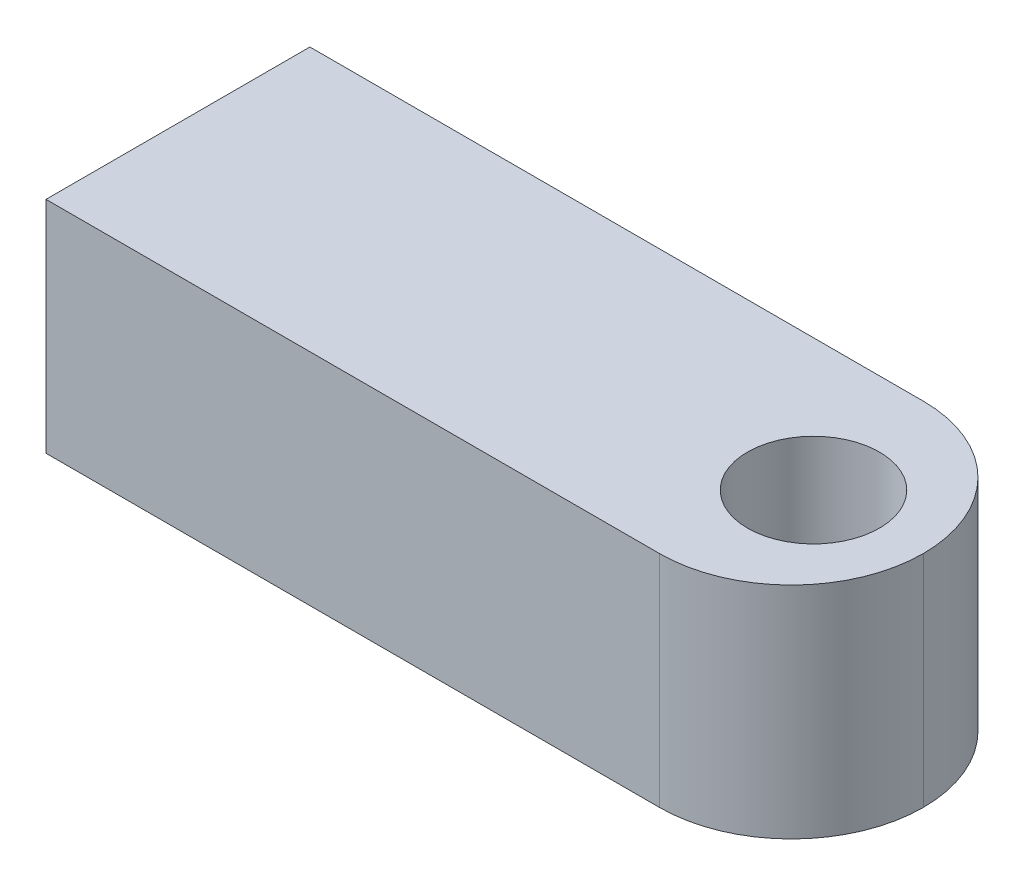
ISO-10303-21;
HEADER;
FILE_DESCRIPTION(('STEP AP214'),'2;1');
FILE_NAME('part.step','',(''),(''),'','','');
FILE_SCHEMA(('AUTOMOTIVE_DESIGN { 1 0 10303 214 1 1 1 1 }'));
ENDSEC;
DATA;
#1=APPLICATION_CONTEXT('core data for automotive mechanical design processes');
#2=APPLICATION_PROTOCOL_DEFINITION('international standard','automotive_design',2000,#1);
#3=PRODUCT_CONTEXT('',#1,'mechanical');
#4=PRODUCT('Part','Part','',(#3));
#5=PRODUCT_RELATED_PRODUCT_CATEGORY('part','',(#4));
#6=PRODUCT_DEFINITION_FORMATION('','',#4);
#7=PRODUCT_DEFINITION_CONTEXT('part definition',#1,'design');
#8=PRODUCT_DEFINITION('design','',#6,#7);
#9=PRODUCT_DEFINITION_SHAPE('','',#8);
#10=(LENGTH_UNIT() NAMED_UNIT(*) SI_UNIT(.MILLI.,.METRE.));
#11=(NAMED_UNIT(*) PLANE_ANGLE_UNIT() SI_UNIT($,.RADIAN.));
#12=(NAMED_UNIT(*) SI_UNIT($,.STERADIAN.) SOLID_ANGLE_UNIT());
#13=UNCERTAINTY_MEASURE_WITH_UNIT(LENGTH_MEASURE(1.E-05),#10,'distance_accuracy_value','');
#14=(GEOMETRIC_REPRESENTATION_CONTEXT(3) GLOBAL_UNCERTAINTY_ASSIGNED_CONTEXT((#13)) GLOBAL_UNIT_ASSIGNED_CONTEXT((#10,
#11,#12)) REPRESENTATION_CONTEXT('',''));
#15=CARTESIAN_POINT('',(0.,0.,0.));
#16=DIRECTION('',(0.,0.,1.));
#17=DIRECTION('',(1.,0.,0.));
#18=AXIS2_PLACEMENT_3D('',#15,#16,#17);
#19=CARTESIAN_POINT('',(0.,10.,0.));
#20=DIRECTION('',(0.,1.,0.));
#21=DIRECTION('',(0.,0.,1.));
#22=AXIS2_PLACEMENT_3D('',#19,#20,#21);
#23=PLANE('',#22);
#24=CARTESIAN_POINT('',(27.8954021384951,10.,0.));
#25=DIRECTION('',(0.,1.,0.));
#26=DIRECTION('',(0.,0.,1.));
#27=AXIS2_PLACEMENT_3D('',#24,#25,#26);
#28=CIRCLE('',#27,6.);
#29=CARTESIAN_POINT('',(27.8954021384951,10.,6.));
#30=VERTEX_POINT('',#29);
#31=CARTESIAN_POINT('',(33.8954021384951,10.,0.));
#32=VERTEX_POINT('',#31);
#33=EDGE_CURVE('E76',#30,#32,#28,.T.);
#34=ORIENTED_EDGE('',*,*,#33,.T.);
#35=CARTESIAN_POINT('',(27.8954021384951,10.,0.));
#36=DIRECTION('',(0.,1.,0.));
#37=DIRECTION('',(0.,0.,1.));
#38=AXIS2_PLACEMENT_3D('',#35,#36,#37);
#39=CIRCLE('',#38,6.);
#40=CARTESIAN_POINT('',(27.8954021384951,10.,-6.));
#41=VERTEX_POINT('',#40);
#42=EDGE_CURVE('E69',#32,#41,#39,.T.);
#43=ORIENTED_EDGE('',*,*,#42,.T.);
#44=DIRECTION('',(1.,0.,0.));
#45=VECTOR('',#44,1.);
#46=CARTESIAN_POINT('',(0.,10.,-6.));
#47=LINE('',#46,#45);
#48=CARTESIAN_POINT('',(0.,10.,-6.));
#49=VERTEX_POINT('',#48);
#50=EDGE_CURVE('E112',#49,#41,#47,.T.);
#51=ORIENTED_EDGE('',*,*,#50,.F.);
#52=DIRECTION('',(0.,0.,1.));
#53=VECTOR('',#52,1.);
#54=CARTESIAN_POINT('',(0.,10.,-6.));
#55=LINE('',#54,#53);
#56=CARTESIAN_POINT('',(0.,10.,6.));
#57=VERTEX_POINT('',#56);
#58=EDGE_CURVE('E113',#49,#57,#55,.T.);
#59=ORIENTED_EDGE('',*,*,#58,.T.);
#60=DIRECTION('',(1.,0.,0.));
#61=VECTOR('',#60,1.);
#62=CARTESIAN_POINT('',(0.,10.,6.));
#63=LINE('',#62,#61);
#64=EDGE_CURVE('E105',#57,#30,#63,.T.);
#65=ORIENTED_EDGE('',*,*,#64,.T.);
#66=EDGE_LOOP('',(#34,#43,#51,#59,#65));
#67=FACE_BOUND('',#66,.T.);
#68=CARTESIAN_POINT('',(28.9,10.,0.));
#69=DIRECTION('',(0.,1.,0.));
#70=DIRECTION('',(0.,0.,1.));
#71=AXIS2_PLACEMENT_3D('',#68,#69,#70);
#72=CIRCLE('',#71,3.);
#73=CARTESIAN_POINT('',(28.9,10.,3.));
#74=VERTEX_POINT('',#73);
#75=EDGE_CURVE('E166',#74,#74,#72,.T.);
#76=ORIENTED_EDGE('',*,*,#75,.F.);
#77=EDGE_LOOP('',(#76));
#78=FACE_BOUND('',#77,.T.);
#79=ADVANCED_FACE('F59',(#67,#78),#23,.T.);
#80=CARTESIAN_POINT('',(0.,0.,0.));
#81=DIRECTION('',(0.,1.,0.));
#82=DIRECTION('',(0.,0.,1.));
#83=AXIS2_PLACEMENT_3D('',#80,#81,#82);
#84=PLANE('',#83);
#85=DIRECTION('',(1.,0.,0.));
#86=VECTOR('',#85,1.);
#87=CARTESIAN_POINT('',(0.,0.,-6.));
#88=LINE('',#87,#86);
#89=CARTESIAN_POINT('',(0.,0.,-6.));
#90=VERTEX_POINT('',#89);
#91=CARTESIAN_POINT('',(27.8954021384951,0.,-6.));
#92=VERTEX_POINT('',#91);
#93=EDGE_CURVE('E121',#90,#92,#88,.T.);
#94=ORIENTED_EDGE('',*,*,#93,.T.);
#95=CARTESIAN_POINT('',(27.8954021384951,0.,0.));
#96=DIRECTION('',(0.,1.,0.));
#97=DIRECTION('',(0.,0.,1.));
#98=AXIS2_PLACEMENT_3D('',#95,#96,#97);
#99=CIRCLE('',#98,6.);
#100=CARTESIAN_POINT('',(33.8954021384951,0.,0.));
#101=VERTEX_POINT('',#100);
#102=EDGE_CURVE('E140',#92,#101,#99,.F.);
#103=ORIENTED_EDGE('',*,*,#102,.T.);
#104=CARTESIAN_POINT('',(27.8954021384951,0.,0.));
#105=DIRECTION('',(0.,1.,0.));
#106=DIRECTION('',(0.,0.,1.));
#107=AXIS2_PLACEMENT_3D('',#104,#105,#106);
#108=CIRCLE('',#107,6.);
#109=CARTESIAN_POINT('',(27.8954021384951,0.,6.));
#110=VERTEX_POINT('',#109);
#111=EDGE_CURVE('E133',#101,#110,#108,.F.);
#112=ORIENTED_EDGE('',*,*,#111,.T.);
#113=DIRECTION('',(1.,0.,0.));
#114=VECTOR('',#113,1.);
#115=CARTESIAN_POINT('',(0.,0.,6.));
#116=LINE('',#115,#114);
#117=CARTESIAN_POINT('',(0.,0.,6.));
#118=VERTEX_POINT('',#117);
#119=EDGE_CURVE('E175',#118,#110,#116,.T.);
#120=ORIENTED_EDGE('',*,*,#119,.F.);
#121=DIRECTION('',(0.,0.,1.));
#122=VECTOR('',#121,1.);
#123=CARTESIAN_POINT('',(0.,0.,-6.));
#124=LINE('',#123,#122);
#125=EDGE_CURVE('E125',#90,#118,#124,.T.);
#126=ORIENTED_EDGE('',*,*,#125,.F.);
#127=EDGE_LOOP('',(#94,#103,#112,#120,#126));
#128=FACE_BOUND('',#127,.T.);
#129=CARTESIAN_POINT('',(28.9,0.,0.));
#130=DIRECTION('',(0.,1.,0.));
#131=DIRECTION('',(0.,0.,1.));
#132=AXIS2_PLACEMENT_3D('',#129,#130,#131);
#133=CIRCLE('',#132,3.);
#134=CARTESIAN_POINT('',(28.9,0.,3.));
#135=VERTEX_POINT('',#134);
#136=EDGE_CURVE('E163',#135,#135,#133,.T.);
#137=ORIENTED_EDGE('',*,*,#136,.T.);
#138=EDGE_LOOP('',(#137));
#139=FACE_BOUND('',#138,.T.);
#140=ADVANCED_FACE('F159',(#128,#139),#84,.F.);
#141=CARTESIAN_POINT('',(0.,10.,-6.));
#142=DIRECTION('',(1.,0.,0.));
#143=DIRECTION('',(0.,0.,-1.));
#144=AXIS2_PLACEMENT_3D('',#141,#142,#143);
#145=PLANE('',#144);
#146=ORIENTED_EDGE('',*,*,#125,.T.);
#147=DIRECTION('',(0.,-1.,0.));
#148=VECTOR('',#147,1.);
#149=CARTESIAN_POINT('',(0.,10.,6.));
#150=LINE('',#149,#148);
#151=EDGE_CURVE('E109',#57,#118,#150,.T.);
#152=ORIENTED_EDGE('',*,*,#151,.F.);
#153=ORIENTED_EDGE('',*,*,#58,.F.);
#154=DIRECTION('',(0.,-1.,0.));
#155=VECTOR('',#154,1.);
#156=CARTESIAN_POINT('',(0.,10.,-6.));
#157=LINE('',#156,#155);
#158=EDGE_CURVE('E128',#49,#90,#157,.T.);
#159=ORIENTED_EDGE('',*,*,#158,.T.);
#160=EDGE_LOOP('',(#146,#152,#153,#159));
#161=FACE_BOUND('',#160,.T.);
#162=ADVANCED_FACE('F123',(#161),#145,.F.);
#163=CARTESIAN_POINT('',(0.,10.,6.));
#164=DIRECTION('',(0.,0.,-1.));
#165=DIRECTION('',(-1.,0.,0.));
#166=AXIS2_PLACEMENT_3D('',#163,#164,#165);
#167=PLANE('',#166);
#168=ORIENTED_EDGE('',*,*,#119,.T.);
#169=DIRECTION('',(0.,-1.,0.));
#170=VECTOR('',#169,1.);
#171=CARTESIAN_POINT('',(27.8954021384951,10.,6.));
#172=LINE('',#171,#170);
#173=EDGE_CURVE('E12',#110,#30,#172,.F.);
#174=ORIENTED_EDGE('',*,*,#173,.T.);
#175=ORIENTED_EDGE('',*,*,#64,.F.);
#176=ORIENTED_EDGE('',*,*,#151,.T.);
#177=EDGE_LOOP('',(#168,#174,#175,#176));
#178=FACE_BOUND('',#177,.T.);
#179=ADVANCED_FACE('F107',(#178),#167,.F.);
#180=CARTESIAN_POINT('',(0.,10.,-6.));
#181=DIRECTION('',(0.,0.,-1.));
#182=DIRECTION('',(-1.,0.,0.));
#183=AXIS2_PLACEMENT_3D('',#180,#181,#182);
#184=PLANE('',#183);
#185=ORIENTED_EDGE('',*,*,#50,.T.);
#186=DIRECTION('',(0.,-1.,0.));
#187=VECTOR('',#186,1.);
#188=CARTESIAN_POINT('',(27.8954021384951,10.,-6.));
#189=LINE('',#188,#187);
#190=EDGE_CURVE('E127',#41,#92,#189,.T.);
#191=ORIENTED_EDGE('',*,*,#190,.T.);
#192=ORIENTED_EDGE('',*,*,#93,.F.);
#193=ORIENTED_EDGE('',*,*,#158,.F.);
#194=EDGE_LOOP('',(#185,#191,#192,#193));
#195=FACE_BOUND('',#194,.T.);
#196=ADVANCED_FACE('F151',(#195),#184,.T.);
#197=CARTESIAN_POINT('',(28.9,10.,0.));
#198=DIRECTION('',(0.,-1.,0.));
#199=DIRECTION('',(0.,0.,-1.));
#200=AXIS2_PLACEMENT_3D('',#197,#198,#199);
#201=CYLINDRICAL_SURFACE('',#200,3.);
#202=ORIENTED_EDGE('',*,*,#75,.T.);
#203=EDGE_LOOP('',(#202));
#204=FACE_BOUND('',#203,.T.);
#205=ORIENTED_EDGE('',*,*,#136,.F.);
#206=EDGE_LOOP('',(#205));
#207=FACE_BOUND('',#206,.T.);
#208=ADVANCED_FACE('F180',(#204,#207),#201,.F.);
#209=CARTESIAN_POINT('',(27.8954021384951,10.,0.));
#210=DIRECTION('',(0.,1.,0.));
#211=DIRECTION('',(0.,0.,1.));
#212=AXIS2_PLACEMENT_3D('',#209,#210,#211);
#213=CYLINDRICAL_SURFACE('',#212,6.);
#214=DIRECTION('',(0.,-1.,0.));
#215=VECTOR('',#214,1.);
#216=CARTESIAN_POINT('',(33.8954021384951,0.,0.));
#217=LINE('',#216,#215);
#218=EDGE_CURVE('E63',#32,#101,#217,.T.);
#219=ORIENTED_EDGE('',*,*,#218,.F.);
#220=ORIENTED_EDGE('',*,*,#33,.F.);
#221=ORIENTED_EDGE('',*,*,#173,.F.);
#222=ORIENTED_EDGE('',*,*,#111,.F.);
#223=EDGE_LOOP('',(#219,#220,#221,#222));
#224=FACE_BOUND('',#223,.T.);
#225=ADVANCED_FACE('F61',(#224),#213,.T.);
#226=CARTESIAN_POINT('',(27.8954021384951,10.,0.));
#227=DIRECTION('',(0.,-1.,0.));
#228=DIRECTION('',(0.,0.,-1.));
#229=AXIS2_PLACEMENT_3D('',#226,#227,#228);
#230=CYLINDRICAL_SURFACE('',#229,6.);
#231=ORIENTED_EDGE('',*,*,#42,.F.);
#232=ORIENTED_EDGE('',*,*,#218,.T.);
#233=ORIENTED_EDGE('',*,*,#102,.F.);
#234=ORIENTED_EDGE('',*,*,#190,.F.);
#235=EDGE_LOOP('',(#231,#232,#233,#234));
#236=FACE_BOUND('',#235,.T.);
#237=ADVANCED_FACE('F156',(#236),#230,.T.);
#238=CLOSED_SHELL('',(#79,#140,#162,#179,#196,#208,#225,#237));
#239=MANIFOLD_SOLID_BREP('B2',#238);
#240=ADVANCED_BREP_SHAPE_REPRESENTATION('',(#18,#239),#14);
#241=SHAPE_DEFINITION_REPRESENTATION(#9,#240);
ENDSEC;
END-ISO-10303-21;
